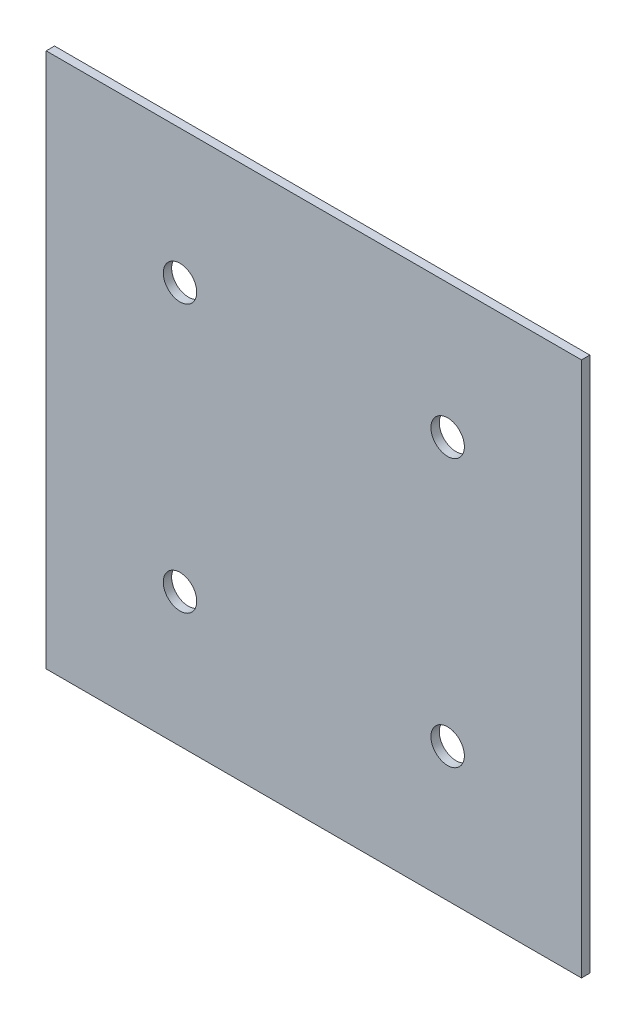
ISO-10303-21;
HEADER;
FILE_DESCRIPTION(('STEP AP214'),'2;1');
FILE_NAME('part.step','',(''),(''),'','','');
FILE_SCHEMA(('AUTOMOTIVE_DESIGN { 1 0 10303 214 1 1 1 1 }'));
ENDSEC;
DATA;
#1=APPLICATION_CONTEXT('core data for automotive mechanical design processes');
#2=APPLICATION_PROTOCOL_DEFINITION('international standard','automotive_design',2000,#1);
#3=PRODUCT_CONTEXT('',#1,'mechanical');
#4=PRODUCT('Part','Part','',(#3));
#5=PRODUCT_RELATED_PRODUCT_CATEGORY('part','',(#4));
#6=PRODUCT_DEFINITION_FORMATION('','',#4);
#7=PRODUCT_DEFINITION_CONTEXT('part definition',#1,'design');
#8=PRODUCT_DEFINITION('design','',#6,#7);
#9=PRODUCT_DEFINITION_SHAPE('','',#8);
#10=(LENGTH_UNIT() NAMED_UNIT(*) SI_UNIT(.MILLI.,.METRE.));
#11=(NAMED_UNIT(*) PLANE_ANGLE_UNIT() SI_UNIT($,.RADIAN.));
#12=(NAMED_UNIT(*) SI_UNIT($,.STERADIAN.) SOLID_ANGLE_UNIT());
#13=UNCERTAINTY_MEASURE_WITH_UNIT(LENGTH_MEASURE(1.E-05),#10,'distance_accuracy_value','');
#14=(GEOMETRIC_REPRESENTATION_CONTEXT(3) GLOBAL_UNCERTAINTY_ASSIGNED_CONTEXT((#13)) GLOBAL_UNIT_ASSIGNED_CONTEXT((#10,
#11,#12)) REPRESENTATION_CONTEXT('',''));
#15=CARTESIAN_POINT('',(0.,0.,0.));
#16=DIRECTION('',(0.,0.,1.));
#17=DIRECTION('',(1.,0.,0.));
#18=AXIS2_PLACEMENT_3D('',#15,#16,#17);
#19=CARTESIAN_POINT('',(0.,0.,2.5));
#20=DIRECTION('',(1.,0.,0.));
#21=DIRECTION('',(0.,0.,-1.));
#22=AXIS2_PLACEMENT_3D('',#19,#20,#21);
#23=PLANE('',#22);
#24=DIRECTION('',(0.,-1.,0.));
#25=VECTOR('',#24,1.);
#26=CARTESIAN_POINT('',(0.,0.,0.));
#27=LINE('',#26,#25);
#28=CARTESIAN_POINT('',(0.,160.,0.));
#29=VERTEX_POINT('',#28);
#30=CARTESIAN_POINT('',(0.,0.,0.));
#31=VERTEX_POINT('',#30);
#32=EDGE_CURVE('E103',#29,#31,#27,.T.);
#33=ORIENTED_EDGE('',*,*,#32,.T.);
#34=DIRECTION('',(0.,0.,-1.));
#35=VECTOR('',#34,1.);
#36=CARTESIAN_POINT('',(0.,0.,2.5));
#37=LINE('',#36,#35);
#38=CARTESIAN_POINT('',(0.,0.,2.5));
#39=VERTEX_POINT('',#38);
#40=EDGE_CURVE('E94',#39,#31,#37,.T.);
#41=ORIENTED_EDGE('',*,*,#40,.F.);
#42=DIRECTION('',(0.,-1.,0.));
#43=VECTOR('',#42,1.);
#44=CARTESIAN_POINT('',(0.,0.,2.5));
#45=LINE('',#44,#43);
#46=CARTESIAN_POINT('',(0.,160.,2.5));
#47=VERTEX_POINT('',#46);
#48=EDGE_CURVE('E88',#47,#39,#45,.T.);
#49=ORIENTED_EDGE('',*,*,#48,.F.);
#50=DIRECTION('',(0.,0.,-1.));
#51=VECTOR('',#50,1.);
#52=CARTESIAN_POINT('',(0.,160.,2.5));
#53=LINE('',#52,#51);
#54=EDGE_CURVE('E99',#47,#29,#53,.T.);
#55=ORIENTED_EDGE('',*,*,#54,.T.);
#56=EDGE_LOOP('',(#33,#41,#49,#55));
#57=FACE_BOUND('',#56,.T.);
#58=ADVANCED_FACE('F34',(#57),#23,.F.);
#59=CARTESIAN_POINT('',(0.,0.,2.5));
#60=DIRECTION('',(0.,1.,0.));
#61=DIRECTION('',(0.,0.,1.));
#62=AXIS2_PLACEMENT_3D('',#59,#60,#61);
#63=PLANE('',#62);
#64=DIRECTION('',(1.,0.,0.));
#65=VECTOR('',#64,1.);
#66=CARTESIAN_POINT('',(0.,0.,0.));
#67=LINE('',#66,#65);
#68=CARTESIAN_POINT('',(160.,0.,0.));
#69=VERTEX_POINT('',#68);
#70=EDGE_CURVE('E93',#31,#69,#67,.T.);
#71=ORIENTED_EDGE('',*,*,#70,.T.);
#72=DIRECTION('',(0.,0.,-1.));
#73=VECTOR('',#72,1.);
#74=CARTESIAN_POINT('',(160.,0.,2.5));
#75=LINE('',#74,#73);
#76=CARTESIAN_POINT('',(160.,0.,2.5));
#77=VERTEX_POINT('',#76);
#78=EDGE_CURVE('E91',#77,#69,#75,.T.);
#79=ORIENTED_EDGE('',*,*,#78,.F.);
#80=DIRECTION('',(1.,0.,0.));
#81=VECTOR('',#80,1.);
#82=CARTESIAN_POINT('',(0.,0.,2.5));
#83=LINE('',#82,#81);
#84=EDGE_CURVE('E82',#39,#77,#83,.T.);
#85=ORIENTED_EDGE('',*,*,#84,.F.);
#86=ORIENTED_EDGE('',*,*,#40,.T.);
#87=EDGE_LOOP('',(#71,#79,#85,#86));
#88=FACE_BOUND('',#87,.T.);
#89=ADVANCED_FACE('F92',(#88),#63,.F.);
#90=CARTESIAN_POINT('',(160.,0.,2.5));
#91=DIRECTION('',(-1.,0.,0.));
#92=DIRECTION('',(0.,0.,1.));
#93=AXIS2_PLACEMENT_3D('',#90,#91,#92);
#94=PLANE('',#93);
#95=DIRECTION('',(0.,1.,0.));
#96=VECTOR('',#95,1.);
#97=CARTESIAN_POINT('',(160.,0.,0.));
#98=LINE('',#97,#96);
#99=CARTESIAN_POINT('',(160.,160.,0.));
#100=VERTEX_POINT('',#99);
#101=EDGE_CURVE('E68',#69,#100,#98,.T.);
#102=ORIENTED_EDGE('',*,*,#101,.T.);
#103=DIRECTION('',(0.,0.,-1.));
#104=VECTOR('',#103,1.);
#105=CARTESIAN_POINT('',(160.,160.,2.5));
#106=LINE('',#105,#104);
#107=CARTESIAN_POINT('',(160.,160.,2.5));
#108=VERTEX_POINT('',#107);
#109=EDGE_CURVE('E95',#108,#100,#106,.T.);
#110=ORIENTED_EDGE('',*,*,#109,.F.);
#111=DIRECTION('',(0.,1.,0.));
#112=VECTOR('',#111,1.);
#113=CARTESIAN_POINT('',(160.,0.,2.5));
#114=LINE('',#113,#112);
#115=EDGE_CURVE('E86',#77,#108,#114,.T.);
#116=ORIENTED_EDGE('',*,*,#115,.F.);
#117=ORIENTED_EDGE('',*,*,#78,.T.);
#118=EDGE_LOOP('',(#102,#110,#116,#117));
#119=FACE_BOUND('',#118,.T.);
#120=ADVANCED_FACE('F97',(#119),#94,.F.);
#121=CARTESIAN_POINT('',(0.,160.,2.5));
#122=DIRECTION('',(0.,-1.,0.));
#123=DIRECTION('',(0.,0.,-1.));
#124=AXIS2_PLACEMENT_3D('',#121,#122,#123);
#125=PLANE('',#124);
#126=DIRECTION('',(-1.,0.,0.));
#127=VECTOR('',#126,1.);
#128=CARTESIAN_POINT('',(0.,160.,0.));
#129=LINE('',#128,#127);
#130=EDGE_CURVE('E74',#100,#29,#129,.T.);
#131=ORIENTED_EDGE('',*,*,#130,.T.);
#132=ORIENTED_EDGE('',*,*,#54,.F.);
#133=DIRECTION('',(-1.,0.,0.));
#134=VECTOR('',#133,1.);
#135=CARTESIAN_POINT('',(0.,160.,2.5));
#136=LINE('',#135,#134);
#137=EDGE_CURVE('E51',#108,#47,#136,.T.);
#138=ORIENTED_EDGE('',*,*,#137,.F.);
#139=ORIENTED_EDGE('',*,*,#109,.T.);
#140=EDGE_LOOP('',(#131,#132,#138,#139));
#141=FACE_BOUND('',#140,.T.);
#142=ADVANCED_FACE('F129',(#141),#125,.F.);
#143=CARTESIAN_POINT('',(0.,0.,2.5));
#144=DIRECTION('',(0.,0.,-1.));
#145=DIRECTION('',(-1.,0.,0.));
#146=AXIS2_PLACEMENT_3D('',#143,#144,#145);
#147=PLANE('',#146);
#148=CARTESIAN_POINT('',(120.,120.,2.5));
#149=DIRECTION('',(0.,0.,1.));
#150=DIRECTION('',(1.,0.,0.));
#151=AXIS2_PLACEMENT_3D('',#148,#149,#150);
#152=CIRCLE('',#151,5.);
#153=CARTESIAN_POINT('',(125.,120.,2.5));
#154=VERTEX_POINT('',#153);
#155=EDGE_CURVE('E172',#154,#154,#152,.T.);
#156=ORIENTED_EDGE('',*,*,#155,.F.);
#157=EDGE_LOOP('',(#156));
#158=FACE_BOUND('',#157,.T.);
#159=CARTESIAN_POINT('',(40.,120.,2.5));
#160=DIRECTION('',(0.,0.,1.));
#161=DIRECTION('',(1.,0.,0.));
#162=AXIS2_PLACEMENT_3D('',#159,#160,#161);
#163=CIRCLE('',#162,5.);
#164=CARTESIAN_POINT('',(45.,120.,2.5));
#165=VERTEX_POINT('',#164);
#166=EDGE_CURVE('E173',#165,#165,#163,.T.);
#167=ORIENTED_EDGE('',*,*,#166,.F.);
#168=EDGE_LOOP('',(#167));
#169=FACE_BOUND('',#168,.T.);
#170=ORIENTED_EDGE('',*,*,#48,.T.);
#171=ORIENTED_EDGE('',*,*,#84,.T.);
#172=ORIENTED_EDGE('',*,*,#115,.T.);
#173=ORIENTED_EDGE('',*,*,#137,.T.);
#174=EDGE_LOOP('',(#170,#171,#172,#173));
#175=FACE_BOUND('',#174,.T.);
#176=CARTESIAN_POINT('',(40.,40.,2.5));
#177=DIRECTION('',(0.,0.,1.));
#178=DIRECTION('',(1.,0.,0.));
#179=AXIS2_PLACEMENT_3D('',#176,#177,#178);
#180=CIRCLE('',#179,5.);
#181=CARTESIAN_POINT('',(45.,40.,2.5));
#182=VERTEX_POINT('',#181);
#183=EDGE_CURVE('E116',#182,#182,#180,.T.);
#184=ORIENTED_EDGE('',*,*,#183,.F.);
#185=EDGE_LOOP('',(#184));
#186=FACE_BOUND('',#185,.T.);
#187=CARTESIAN_POINT('',(120.,40.,2.5));
#188=DIRECTION('',(0.,0.,1.));
#189=DIRECTION('',(1.,0.,0.));
#190=AXIS2_PLACEMENT_3D('',#187,#188,#189);
#191=CIRCLE('',#190,5.);
#192=CARTESIAN_POINT('',(125.,40.,2.5));
#193=VERTEX_POINT('',#192);
#194=EDGE_CURVE('E11',#193,#193,#191,.T.);
#195=ORIENTED_EDGE('',*,*,#194,.F.);
#196=EDGE_LOOP('',(#195));
#197=FACE_BOUND('',#196,.T.);
#198=ADVANCED_FACE('F83',(#158,#169,#175,#186,#197),#147,.F.);
#199=CARTESIAN_POINT('',(0.,0.,0.));
#200=DIRECTION('',(0.,0.,-1.));
#201=DIRECTION('',(-1.,0.,0.));
#202=AXIS2_PLACEMENT_3D('',#199,#200,#201);
#203=PLANE('',#202);
#204=CARTESIAN_POINT('',(120.,120.,0.));
#205=DIRECTION('',(0.,0.,1.));
#206=DIRECTION('',(1.,0.,0.));
#207=AXIS2_PLACEMENT_3D('',#204,#205,#206);
#208=CIRCLE('',#207,5.);
#209=CARTESIAN_POINT('',(125.,120.,0.));
#210=VERTEX_POINT('',#209);
#211=EDGE_CURVE('E170',#210,#210,#208,.T.);
#212=ORIENTED_EDGE('',*,*,#211,.T.);
#213=EDGE_LOOP('',(#212));
#214=FACE_BOUND('',#213,.T.);
#215=CARTESIAN_POINT('',(40.,120.,0.));
#216=DIRECTION('',(0.,0.,1.));
#217=DIRECTION('',(1.,0.,0.));
#218=AXIS2_PLACEMENT_3D('',#215,#216,#217);
#219=CIRCLE('',#218,5.);
#220=CARTESIAN_POINT('',(45.,120.,0.));
#221=VERTEX_POINT('',#220);
#222=EDGE_CURVE('E106',#221,#221,#219,.T.);
#223=ORIENTED_EDGE('',*,*,#222,.T.);
#224=EDGE_LOOP('',(#223));
#225=FACE_BOUND('',#224,.T.);
#226=ORIENTED_EDGE('',*,*,#32,.F.);
#227=ORIENTED_EDGE('',*,*,#130,.F.);
#228=ORIENTED_EDGE('',*,*,#101,.F.);
#229=ORIENTED_EDGE('',*,*,#70,.F.);
#230=EDGE_LOOP('',(#226,#227,#228,#229));
#231=FACE_BOUND('',#230,.T.);
#232=CARTESIAN_POINT('',(40.,40.,0.));
#233=DIRECTION('',(0.,0.,1.));
#234=DIRECTION('',(1.,0.,0.));
#235=AXIS2_PLACEMENT_3D('',#232,#233,#234);
#236=CIRCLE('',#235,5.);
#237=CARTESIAN_POINT('',(45.,40.,0.));
#238=VERTEX_POINT('',#237);
#239=EDGE_CURVE('E113',#238,#238,#236,.T.);
#240=ORIENTED_EDGE('',*,*,#239,.T.);
#241=EDGE_LOOP('',(#240));
#242=FACE_BOUND('',#241,.T.);
#243=CARTESIAN_POINT('',(120.,40.,0.));
#244=DIRECTION('',(0.,0.,1.));
#245=DIRECTION('',(1.,0.,0.));
#246=AXIS2_PLACEMENT_3D('',#243,#244,#245);
#247=CIRCLE('',#246,5.);
#248=CARTESIAN_POINT('',(125.,40.,0.));
#249=VERTEX_POINT('',#248);
#250=EDGE_CURVE('E43',#249,#249,#247,.T.);
#251=ORIENTED_EDGE('',*,*,#250,.T.);
#252=EDGE_LOOP('',(#251));
#253=FACE_BOUND('',#252,.T.);
#254=ADVANCED_FACE('F121',(#214,#225,#231,#242,#253),#203,.T.);
#255=CARTESIAN_POINT('',(40.,120.,0.));
#256=DIRECTION('',(0.,0.,1.));
#257=DIRECTION('',(1.,0.,0.));
#258=AXIS2_PLACEMENT_3D('',#255,#256,#257);
#259=CYLINDRICAL_SURFACE('',#258,5.);
#260=ORIENTED_EDGE('',*,*,#222,.F.);
#261=EDGE_LOOP('',(#260));
#262=FACE_BOUND('',#261,.T.);
#263=ORIENTED_EDGE('',*,*,#166,.T.);
#264=EDGE_LOOP('',(#263));
#265=FACE_BOUND('',#264,.T.);
#266=ADVANCED_FACE('F136',(#262,#265),#259,.F.);
#267=CARTESIAN_POINT('',(120.,120.,0.));
#268=DIRECTION('',(0.,0.,1.));
#269=DIRECTION('',(1.,0.,0.));
#270=AXIS2_PLACEMENT_3D('',#267,#268,#269);
#271=CYLINDRICAL_SURFACE('',#270,5.);
#272=ORIENTED_EDGE('',*,*,#211,.F.);
#273=EDGE_LOOP('',(#272));
#274=FACE_BOUND('',#273,.T.);
#275=ORIENTED_EDGE('',*,*,#155,.T.);
#276=EDGE_LOOP('',(#275));
#277=FACE_BOUND('',#276,.T.);
#278=ADVANCED_FACE('F152',(#274,#277),#271,.F.);
#279=CARTESIAN_POINT('',(40.,40.,0.));
#280=DIRECTION('',(0.,0.,1.));
#281=DIRECTION('',(1.,0.,0.));
#282=AXIS2_PLACEMENT_3D('',#279,#280,#281);
#283=CYLINDRICAL_SURFACE('',#282,5.);
#284=ORIENTED_EDGE('',*,*,#239,.F.);
#285=EDGE_LOOP('',(#284));
#286=FACE_BOUND('',#285,.T.);
#287=ORIENTED_EDGE('',*,*,#183,.T.);
#288=EDGE_LOOP('',(#287));
#289=FACE_BOUND('',#288,.T.);
#290=ADVANCED_FACE('F125',(#286,#289),#283,.F.);
#291=CARTESIAN_POINT('',(120.,40.,0.));
#292=DIRECTION('',(0.,0.,1.));
#293=DIRECTION('',(1.,0.,0.));
#294=AXIS2_PLACEMENT_3D('',#291,#292,#293);
#295=CYLINDRICAL_SURFACE('',#294,5.);
#296=ORIENTED_EDGE('',*,*,#250,.F.);
#297=EDGE_LOOP('',(#296));
#298=FACE_BOUND('',#297,.T.);
#299=ORIENTED_EDGE('',*,*,#194,.T.);
#300=EDGE_LOOP('',(#299));
#301=FACE_BOUND('',#300,.T.);
#302=ADVANCED_FACE('F36',(#298,#301),#295,.F.);
#303=CLOSED_SHELL('',(#58,#89,#120,#142,#198,#254,#266,#278,#290,#302));
#304=MANIFOLD_SOLID_BREP('B2',#303);
#305=ADVANCED_BREP_SHAPE_REPRESENTATION('',(#18,#304),#14);
#306=SHAPE_DEFINITION_REPRESENTATION(#9,#305);
ENDSEC;
END-ISO-10303-21;
